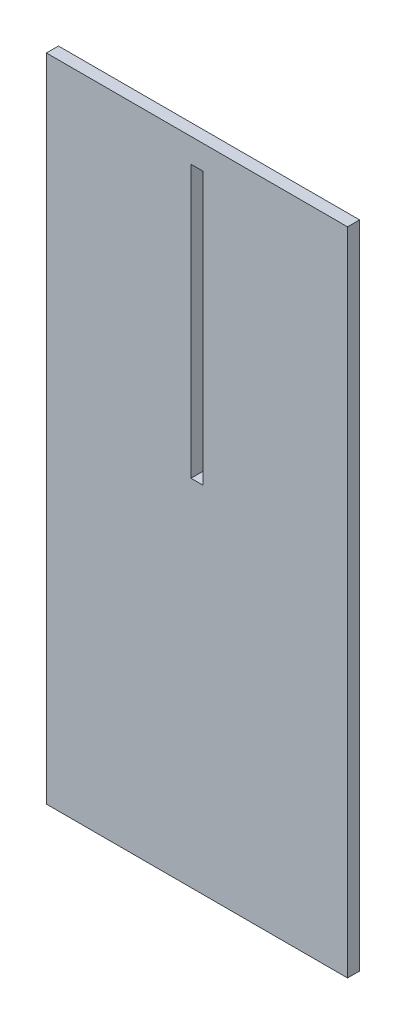
ISO-10303-21;
HEADER;
FILE_DESCRIPTION(('STEP AP214'),'2;1');
FILE_NAME('part.step','',(''),(''),'','','');
FILE_SCHEMA(('AUTOMOTIVE_DESIGN { 1 0 10303 214 1 1 1 1 }'));
ENDSEC;
DATA;
#1=APPLICATION_CONTEXT('core data for automotive mechanical design processes');
#2=APPLICATION_PROTOCOL_DEFINITION('international standard','automotive_design',2000,#1);
#3=PRODUCT_CONTEXT('',#1,'mechanical');
#4=PRODUCT('Part','Part','',(#3));
#5=PRODUCT_RELATED_PRODUCT_CATEGORY('part','',(#4));
#6=PRODUCT_DEFINITION_FORMATION('','',#4);
#7=PRODUCT_DEFINITION_CONTEXT('part definition',#1,'design');
#8=PRODUCT_DEFINITION('design','',#6,#7);
#9=PRODUCT_DEFINITION_SHAPE('','',#8);
#10=(LENGTH_UNIT() NAMED_UNIT(*) SI_UNIT(.MILLI.,.METRE.));
#11=(NAMED_UNIT(*) PLANE_ANGLE_UNIT() SI_UNIT($,.RADIAN.));
#12=(NAMED_UNIT(*) SI_UNIT($,.STERADIAN.) SOLID_ANGLE_UNIT());
#13=UNCERTAINTY_MEASURE_WITH_UNIT(LENGTH_MEASURE(1.E-05),#10,'distance_accuracy_value','');
#14=(GEOMETRIC_REPRESENTATION_CONTEXT(3) GLOBAL_UNCERTAINTY_ASSIGNED_CONTEXT((#13)) GLOBAL_UNIT_ASSIGNED_CONTEXT((#10,
#11,#12)) REPRESENTATION_CONTEXT('',''));
#15=CARTESIAN_POINT('',(0.,0.,0.));
#16=DIRECTION('',(0.,0.,1.));
#17=DIRECTION('',(1.,0.,0.));
#18=AXIS2_PLACEMENT_3D('',#15,#16,#17);
#19=CARTESIAN_POINT('',(0.,0.,5.));
#20=DIRECTION('',(0.,0.,1.));
#21=DIRECTION('',(1.,0.,0.));
#22=AXIS2_PLACEMENT_3D('',#19,#20,#21);
#23=PLANE('',#22);
#24=DIRECTION('',(0.,-1.,0.));
#25=VECTOR('',#24,1.);
#26=CARTESIAN_POINT('',(0.,0.,5.));
#27=LINE('',#26,#25);
#28=CARTESIAN_POINT('',(0.,0.,5.));
#29=VERTEX_POINT('',#28);
#30=CARTESIAN_POINT('',(0.,-270.,5.));
#31=VERTEX_POINT('',#30);
#32=EDGE_CURVE('E153',#29,#31,#27,.T.);
#33=ORIENTED_EDGE('',*,*,#32,.T.);
#34=DIRECTION('',(1.,0.,0.));
#35=VECTOR('',#34,1.);
#36=CARTESIAN_POINT('',(0.,-270.,5.));
#37=LINE('',#36,#35);
#38=CARTESIAN_POINT('',(125.,-270.,5.));
#39=VERTEX_POINT('',#38);
#40=EDGE_CURVE('E157',#31,#39,#37,.T.);
#41=ORIENTED_EDGE('',*,*,#40,.T.);
#42=DIRECTION('',(0.,1.,0.));
#43=VECTOR('',#42,1.);
#44=CARTESIAN_POINT('',(125.,0.,5.));
#45=LINE('',#44,#43);
#46=CARTESIAN_POINT('',(125.,0.,5.));
#47=VERTEX_POINT('',#46);
#48=EDGE_CURVE('E161',#39,#47,#45,.T.);
#49=ORIENTED_EDGE('',*,*,#48,.T.);
#50=DIRECTION('',(-1.,0.,0.));
#51=VECTOR('',#50,1.);
#52=CARTESIAN_POINT('',(0.,0.,5.));
#53=LINE('',#52,#51);
#54=EDGE_CURVE('E164',#47,#29,#53,.T.);
#55=ORIENTED_EDGE('',*,*,#54,.T.);
#56=EDGE_LOOP('',(#33,#41,#49,#55));
#57=FACE_BOUND('',#56,.T.);
#58=DIRECTION('',(1.,0.,0.));
#59=VECTOR('',#58,1.);
#60=CARTESIAN_POINT('',(60.,-122.865850887169,5.));
#61=LINE('',#60,#59);
#62=CARTESIAN_POINT('',(60.,-122.865850887169,5.));
#63=VERTEX_POINT('',#62);
#64=CARTESIAN_POINT('',(65.,-122.865850887169,5.));
#65=VERTEX_POINT('',#64);
#66=EDGE_CURVE('E114',#63,#65,#61,.T.);
#67=ORIENTED_EDGE('',*,*,#66,.F.);
#68=DIRECTION('',(0.,-1.,0.));
#69=VECTOR('',#68,1.);
#70=CARTESIAN_POINT('',(60.,-10.,5.));
#71=LINE('',#70,#69);
#72=CARTESIAN_POINT('',(60.,-10.,5.));
#73=VERTEX_POINT('',#72);
#74=EDGE_CURVE('E105',#73,#63,#71,.T.);
#75=ORIENTED_EDGE('',*,*,#74,.F.);
#76=DIRECTION('',(-1.,0.,0.));
#77=VECTOR('',#76,1.);
#78=CARTESIAN_POINT('',(60.,-10.,5.));
#79=LINE('',#78,#77);
#80=CARTESIAN_POINT('',(65.,-10.,5.));
#81=VERTEX_POINT('',#80);
#82=EDGE_CURVE('E131',#81,#73,#79,.T.);
#83=ORIENTED_EDGE('',*,*,#82,.F.);
#84=DIRECTION('',(0.,1.,0.));
#85=VECTOR('',#84,1.);
#86=CARTESIAN_POINT('',(65.,-10.,5.));
#87=LINE('',#86,#85);
#88=EDGE_CURVE('E127',#65,#81,#87,.T.);
#89=ORIENTED_EDGE('',*,*,#88,.F.);
#90=EDGE_LOOP('',(#67,#75,#83,#89));
#91=FACE_BOUND('',#90,.T.);
#92=ADVANCED_FACE('F39',(#57,#91),#23,.T.);
#93=CARTESIAN_POINT('',(0.,0.,0.));
#94=DIRECTION('',(0.,0.,1.));
#95=DIRECTION('',(1.,0.,0.));
#96=AXIS2_PLACEMENT_3D('',#93,#94,#95);
#97=PLANE('',#96);
#98=DIRECTION('',(0.,-1.,0.));
#99=VECTOR('',#98,1.);
#100=CARTESIAN_POINT('',(0.,0.,0.));
#101=LINE('',#100,#99);
#102=CARTESIAN_POINT('',(0.,0.,0.));
#103=VERTEX_POINT('',#102);
#104=CARTESIAN_POINT('',(0.,-270.,0.));
#105=VERTEX_POINT('',#104);
#106=EDGE_CURVE('E123',#103,#105,#101,.T.);
#107=ORIENTED_EDGE('',*,*,#106,.F.);
#108=DIRECTION('',(-1.,0.,0.));
#109=VECTOR('',#108,1.);
#110=CARTESIAN_POINT('',(0.,0.,0.));
#111=LINE('',#110,#109);
#112=CARTESIAN_POINT('',(125.,0.,0.));
#113=VERTEX_POINT('',#112);
#114=EDGE_CURVE('E158',#113,#103,#111,.T.);
#115=ORIENTED_EDGE('',*,*,#114,.F.);
#116=DIRECTION('',(0.,1.,0.));
#117=VECTOR('',#116,1.);
#118=CARTESIAN_POINT('',(125.,0.,0.));
#119=LINE('',#118,#117);
#120=CARTESIAN_POINT('',(125.,-270.,0.));
#121=VERTEX_POINT('',#120);
#122=EDGE_CURVE('E174',#121,#113,#119,.T.);
#123=ORIENTED_EDGE('',*,*,#122,.F.);
#124=DIRECTION('',(1.,0.,0.));
#125=VECTOR('',#124,1.);
#126=CARTESIAN_POINT('',(0.,-270.,0.));
#127=LINE('',#126,#125);
#128=EDGE_CURVE('E171',#105,#121,#127,.T.);
#129=ORIENTED_EDGE('',*,*,#128,.F.);
#130=EDGE_LOOP('',(#107,#115,#123,#129));
#131=FACE_BOUND('',#130,.T.);
#132=DIRECTION('',(0.,-1.,0.));
#133=VECTOR('',#132,1.);
#134=CARTESIAN_POINT('',(60.,-10.,0.));
#135=LINE('',#134,#133);
#136=CARTESIAN_POINT('',(60.,-10.,0.));
#137=VERTEX_POINT('',#136);
#138=CARTESIAN_POINT('',(60.,-122.865850887169,0.));
#139=VERTEX_POINT('',#138);
#140=EDGE_CURVE('E63',#137,#139,#135,.T.);
#141=ORIENTED_EDGE('',*,*,#140,.T.);
#142=DIRECTION('',(1.,0.,0.));
#143=VECTOR('',#142,1.);
#144=CARTESIAN_POINT('',(60.,-122.865850887169,0.));
#145=LINE('',#144,#143);
#146=CARTESIAN_POINT('',(65.,-122.865850887169,0.));
#147=VERTEX_POINT('',#146);
#148=EDGE_CURVE('E121',#139,#147,#145,.T.);
#149=ORIENTED_EDGE('',*,*,#148,.T.);
#150=DIRECTION('',(0.,1.,0.));
#151=VECTOR('',#150,1.);
#152=CARTESIAN_POINT('',(65.,-10.,0.));
#153=LINE('',#152,#151);
#154=CARTESIAN_POINT('',(65.,-10.,0.));
#155=VERTEX_POINT('',#154);
#156=EDGE_CURVE('E140',#147,#155,#153,.T.);
#157=ORIENTED_EDGE('',*,*,#156,.T.);
#158=DIRECTION('',(-1.,0.,0.));
#159=VECTOR('',#158,1.);
#160=CARTESIAN_POINT('',(60.,-10.,0.));
#161=LINE('',#160,#159);
#162=EDGE_CURVE('E115',#155,#137,#161,.T.);
#163=ORIENTED_EDGE('',*,*,#162,.T.);
#164=EDGE_LOOP('',(#141,#149,#157,#163));
#165=FACE_BOUND('',#164,.T.);
#166=ADVANCED_FACE('F197',(#131,#165),#97,.F.);
#167=CARTESIAN_POINT('',(0.,0.,5.));
#168=DIRECTION('',(1.,0.,0.));
#169=DIRECTION('',(0.,0.,-1.));
#170=AXIS2_PLACEMENT_3D('',#167,#168,#169);
#171=PLANE('',#170);
#172=ORIENTED_EDGE('',*,*,#106,.T.);
#173=DIRECTION('',(0.,0.,-1.));
#174=VECTOR('',#173,1.);
#175=CARTESIAN_POINT('',(0.,-270.,5.));
#176=LINE('',#175,#174);
#177=EDGE_CURVE('E11',#31,#105,#176,.T.);
#178=ORIENTED_EDGE('',*,*,#177,.F.);
#179=ORIENTED_EDGE('',*,*,#32,.F.);
#180=DIRECTION('',(0.,0.,-1.));
#181=VECTOR('',#180,1.);
#182=CARTESIAN_POINT('',(0.,0.,5.));
#183=LINE('',#182,#181);
#184=EDGE_CURVE('E167',#29,#103,#183,.T.);
#185=ORIENTED_EDGE('',*,*,#184,.T.);
#186=EDGE_LOOP('',(#172,#178,#179,#185));
#187=FACE_BOUND('',#186,.T.);
#188=ADVANCED_FACE('F41',(#187),#171,.F.);
#189=CARTESIAN_POINT('',(0.,-270.,5.));
#190=DIRECTION('',(0.,1.,0.));
#191=DIRECTION('',(0.,0.,1.));
#192=AXIS2_PLACEMENT_3D('',#189,#190,#191);
#193=PLANE('',#192);
#194=ORIENTED_EDGE('',*,*,#128,.T.);
#195=DIRECTION('',(0.,0.,-1.));
#196=VECTOR('',#195,1.);
#197=CARTESIAN_POINT('',(125.,-270.,5.));
#198=LINE('',#197,#196);
#199=EDGE_CURVE('E48',#39,#121,#198,.T.);
#200=ORIENTED_EDGE('',*,*,#199,.F.);
#201=ORIENTED_EDGE('',*,*,#40,.F.);
#202=ORIENTED_EDGE('',*,*,#177,.T.);
#203=EDGE_LOOP('',(#194,#200,#201,#202));
#204=FACE_BOUND('',#203,.T.);
#205=ADVANCED_FACE('F207',(#204),#193,.F.);
#206=CARTESIAN_POINT('',(125.,0.,5.));
#207=DIRECTION('',(-1.,0.,0.));
#208=DIRECTION('',(0.,-1.,0.));
#209=AXIS2_PLACEMENT_3D('',#206,#207,#208);
#210=PLANE('',#209);
#211=ORIENTED_EDGE('',*,*,#122,.T.);
#212=DIRECTION('',(0.,0.,-1.));
#213=VECTOR('',#212,1.);
#214=CARTESIAN_POINT('',(125.,0.,5.));
#215=LINE('',#214,#213);
#216=EDGE_CURVE('E182',#47,#113,#215,.T.);
#217=ORIENTED_EDGE('',*,*,#216,.F.);
#218=ORIENTED_EDGE('',*,*,#48,.F.);
#219=ORIENTED_EDGE('',*,*,#199,.T.);
#220=EDGE_LOOP('',(#211,#217,#218,#219));
#221=FACE_BOUND('',#220,.T.);
#222=ADVANCED_FACE('F191',(#221),#210,.F.);
#223=CARTESIAN_POINT('',(0.,0.,5.));
#224=DIRECTION('',(0.,-1.,0.));
#225=DIRECTION('',(0.,0.,-1.));
#226=AXIS2_PLACEMENT_3D('',#223,#224,#225);
#227=PLANE('',#226);
#228=ORIENTED_EDGE('',*,*,#114,.T.);
#229=ORIENTED_EDGE('',*,*,#184,.F.);
#230=ORIENTED_EDGE('',*,*,#54,.F.);
#231=ORIENTED_EDGE('',*,*,#216,.T.);
#232=EDGE_LOOP('',(#228,#229,#230,#231));
#233=FACE_BOUND('',#232,.T.);
#234=ADVANCED_FACE('F201',(#233),#227,.F.);
#235=CARTESIAN_POINT('',(60.,-10.,5.));
#236=DIRECTION('',(1.,0.,0.));
#237=DIRECTION('',(0.,1.,0.));
#238=AXIS2_PLACEMENT_3D('',#235,#236,#237);
#239=PLANE('',#238);
#240=ORIENTED_EDGE('',*,*,#140,.F.);
#241=DIRECTION('',(0.,0.,-1.));
#242=VECTOR('',#241,1.);
#243=CARTESIAN_POINT('',(60.,-10.,5.));
#244=LINE('',#243,#242);
#245=EDGE_CURVE('E109',#73,#137,#244,.T.);
#246=ORIENTED_EDGE('',*,*,#245,.F.);
#247=ORIENTED_EDGE('',*,*,#74,.T.);
#248=DIRECTION('',(0.,0.,-1.));
#249=VECTOR('',#248,1.);
#250=CARTESIAN_POINT('',(60.,-122.865850887169,5.));
#251=LINE('',#250,#249);
#252=EDGE_CURVE('E108',#63,#139,#251,.T.);
#253=ORIENTED_EDGE('',*,*,#252,.T.);
#254=EDGE_LOOP('',(#240,#246,#247,#253));
#255=FACE_BOUND('',#254,.T.);
#256=ADVANCED_FACE('F107',(#255),#239,.T.);
#257=CARTESIAN_POINT('',(60.,-122.865850887169,5.));
#258=DIRECTION('',(0.,1.,0.));
#259=DIRECTION('',(0.,0.,1.));
#260=AXIS2_PLACEMENT_3D('',#257,#258,#259);
#261=PLANE('',#260);
#262=ORIENTED_EDGE('',*,*,#148,.F.);
#263=ORIENTED_EDGE('',*,*,#252,.F.);
#264=ORIENTED_EDGE('',*,*,#66,.T.);
#265=DIRECTION('',(0.,0.,-1.));
#266=VECTOR('',#265,1.);
#267=CARTESIAN_POINT('',(65.,-122.865850887169,5.));
#268=LINE('',#267,#266);
#269=EDGE_CURVE('E124',#65,#147,#268,.T.);
#270=ORIENTED_EDGE('',*,*,#269,.T.);
#271=EDGE_LOOP('',(#262,#263,#264,#270));
#272=FACE_BOUND('',#271,.T.);
#273=ADVANCED_FACE('F118',(#272),#261,.T.);
#274=CARTESIAN_POINT('',(65.,-10.,5.));
#275=DIRECTION('',(-1.,0.,0.));
#276=DIRECTION('',(0.,-1.,0.));
#277=AXIS2_PLACEMENT_3D('',#274,#275,#276);
#278=PLANE('',#277);
#279=ORIENTED_EDGE('',*,*,#156,.F.);
#280=ORIENTED_EDGE('',*,*,#269,.F.);
#281=ORIENTED_EDGE('',*,*,#88,.T.);
#282=DIRECTION('',(0.,0.,-1.));
#283=VECTOR('',#282,1.);
#284=CARTESIAN_POINT('',(65.,-10.,5.));
#285=LINE('',#284,#283);
#286=EDGE_CURVE('E55',#81,#155,#285,.T.);
#287=ORIENTED_EDGE('',*,*,#286,.T.);
#288=EDGE_LOOP('',(#279,#280,#281,#287));
#289=FACE_BOUND('',#288,.T.);
#290=ADVANCED_FACE('F230',(#289),#278,.T.);
#291=CARTESIAN_POINT('',(60.,-10.,5.));
#292=DIRECTION('',(0.,-1.,0.));
#293=DIRECTION('',(0.,0.,-1.));
#294=AXIS2_PLACEMENT_3D('',#291,#292,#293);
#295=PLANE('',#294);
#296=ORIENTED_EDGE('',*,*,#162,.F.);
#297=ORIENTED_EDGE('',*,*,#286,.F.);
#298=ORIENTED_EDGE('',*,*,#82,.T.);
#299=ORIENTED_EDGE('',*,*,#245,.T.);
#300=EDGE_LOOP('',(#296,#297,#298,#299));
#301=FACE_BOUND('',#300,.T.);
#302=ADVANCED_FACE('F234',(#301),#295,.T.);
#303=CLOSED_SHELL('',(#92,#166,#188,#205,#222,#234,#256,#273,#290,#302));
#304=MANIFOLD_SOLID_BREP('B2',#303);
#305=ADVANCED_BREP_SHAPE_REPRESENTATION('',(#18,#304),#14);
#306=SHAPE_DEFINITION_REPRESENTATION(#9,#305);
ENDSEC;
END-ISO-10303-21;
